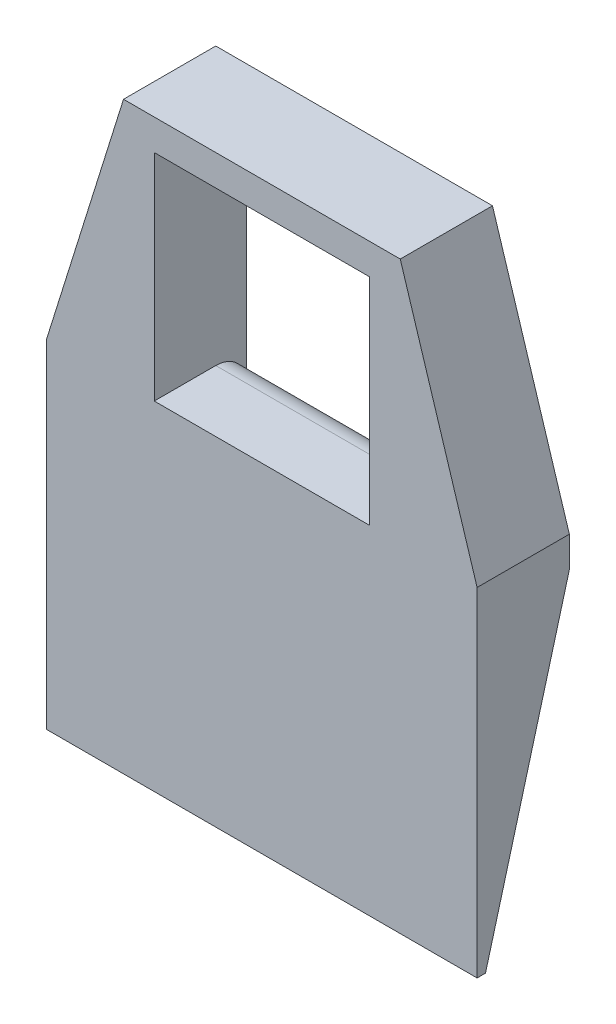
ISO-10303-21;
HEADER;
FILE_DESCRIPTION(('STEP AP214'),'2;1');
FILE_NAME('part.step','',(''),(''),'','','');
FILE_SCHEMA(('AUTOMOTIVE_DESIGN { 1 0 10303 214 1 1 1 1 }'));
ENDSEC;
DATA;
#1=APPLICATION_CONTEXT('core data for automotive mechanical design processes');
#2=APPLICATION_PROTOCOL_DEFINITION('international standard','automotive_design',2000,#1);
#3=PRODUCT_CONTEXT('',#1,'mechanical');
#4=PRODUCT('Part','Part','',(#3));
#5=PRODUCT_RELATED_PRODUCT_CATEGORY('part','',(#4));
#6=PRODUCT_DEFINITION_FORMATION('','',#4);
#7=PRODUCT_DEFINITION_CONTEXT('part definition',#1,'design');
#8=PRODUCT_DEFINITION('design','',#6,#7);
#9=PRODUCT_DEFINITION_SHAPE('','',#8);
#10=(LENGTH_UNIT() NAMED_UNIT(*) SI_UNIT(.MILLI.,.METRE.));
#11=(NAMED_UNIT(*) PLANE_ANGLE_UNIT() SI_UNIT($,.RADIAN.));
#12=(NAMED_UNIT(*) SI_UNIT($,.STERADIAN.) SOLID_ANGLE_UNIT());
#13=UNCERTAINTY_MEASURE_WITH_UNIT(LENGTH_MEASURE(1.E-05),#10,'distance_accuracy_value','');
#14=(GEOMETRIC_REPRESENTATION_CONTEXT(3) GLOBAL_UNCERTAINTY_ASSIGNED_CONTEXT((#13)) GLOBAL_UNIT_ASSIGNED_CONTEXT((#10,
#11,#12)) REPRESENTATION_CONTEXT('',''));
#15=CARTESIAN_POINT('',(0.,0.,0.));
#16=DIRECTION('',(0.,0.,1.));
#17=DIRECTION('',(1.,0.,0.));
#18=AXIS2_PLACEMENT_3D('',#15,#16,#17);
#19=CARTESIAN_POINT('',(-7.,18.,-3.));
#20=DIRECTION('',(-1.,0.,0.));
#21=DIRECTION('',(0.,0.,1.));
#22=AXIS2_PLACEMENT_3D('',#19,#20,#21);
#23=PLANE('',#22);
#24=DIRECTION('',(0.,0.,-1.));
#25=VECTOR('',#24,1.);
#26=CARTESIAN_POINT('',(-7.,16.,3.));
#27=LINE('',#26,#25);
#28=CARTESIAN_POINT('',(-7.,16.,3.));
#29=VERTEX_POINT('',#28);
#30=CARTESIAN_POINT('',(-7.,16.,-3.));
#31=VERTEX_POINT('',#30);
#32=EDGE_CURVE('E171',#29,#31,#27,.T.);
#33=ORIENTED_EDGE('',*,*,#32,.F.);
#34=DIRECTION('',(0.,-1.,0.));
#35=VECTOR('',#34,1.);
#36=CARTESIAN_POINT('',(-7.,18.,3.));
#37=LINE('',#36,#35);
#38=CARTESIAN_POINT('',(-7.,2.,3.));
#39=VERTEX_POINT('',#38);
#40=EDGE_CURVE('E205',#29,#39,#37,.T.);
#41=ORIENTED_EDGE('',*,*,#40,.T.);
#42=DIRECTION('',(0.,0.,-1.));
#43=VECTOR('',#42,1.);
#44=CARTESIAN_POINT('',(-7.,2.,-3.));
#45=LINE('',#44,#43);
#46=CARTESIAN_POINT('',(-7.,2.,-1.));
#47=VERTEX_POINT('',#46);
#48=EDGE_CURVE('E195',#39,#47,#45,.T.);
#49=ORIENTED_EDGE('',*,*,#48,.T.);
#50=CARTESIAN_POINT('',(-7.,0.,-1.));
#51=DIRECTION('',(-1.,0.,0.));
#52=DIRECTION('',(0.,0.,1.));
#53=AXIS2_PLACEMENT_3D('',#50,#51,#52);
#54=CIRCLE('',#53,2.);
#55=CARTESIAN_POINT('',(-7.,0.,-3.));
#56=VERTEX_POINT('',#55);
#57=EDGE_CURVE('E41',#47,#56,#54,.T.);
#58=ORIENTED_EDGE('',*,*,#57,.T.);
#59=DIRECTION('',(0.,-1.,0.));
#60=VECTOR('',#59,1.);
#61=CARTESIAN_POINT('',(-7.,18.,-3.));
#62=LINE('',#61,#60);
#63=EDGE_CURVE('E55',#31,#56,#62,.T.);
#64=ORIENTED_EDGE('',*,*,#63,.F.);
#65=EDGE_LOOP('',(#33,#41,#49,#58,#64));
#66=FACE_BOUND('',#65,.T.);
#67=ADVANCED_FACE('F33',(#66),#23,.F.);
#68=CARTESIAN_POINT('',(7.,18.,-3.));
#69=DIRECTION('',(1.,0.,0.));
#70=DIRECTION('',(0.,0.,-1.));
#71=AXIS2_PLACEMENT_3D('',#68,#69,#70);
#72=PLANE('',#71);
#73=DIRECTION('',(0.,0.,-1.));
#74=VECTOR('',#73,1.);
#75=CARTESIAN_POINT('',(7.,16.,3.));
#76=LINE('',#75,#74);
#77=CARTESIAN_POINT('',(7.,16.,3.));
#78=VERTEX_POINT('',#77);
#79=CARTESIAN_POINT('',(7.,16.,-3.));
#80=VERTEX_POINT('',#79);
#81=EDGE_CURVE('E182',#78,#80,#76,.T.);
#82=ORIENTED_EDGE('',*,*,#81,.T.);
#83=DIRECTION('',(0.,-1.,0.));
#84=VECTOR('',#83,1.);
#85=CARTESIAN_POINT('',(7.,18.,-3.));
#86=LINE('',#85,#84);
#87=CARTESIAN_POINT('',(7.,0.,-3.));
#88=VERTEX_POINT('',#87);
#89=EDGE_CURVE('E47',#80,#88,#86,.T.);
#90=ORIENTED_EDGE('',*,*,#89,.T.);
#91=CARTESIAN_POINT('',(7.,0.,-1.));
#92=DIRECTION('',(1.,0.,0.));
#93=DIRECTION('',(0.,0.,-1.));
#94=AXIS2_PLACEMENT_3D('',#91,#92,#93);
#95=CIRCLE('',#94,2.);
#96=CARTESIAN_POINT('',(7.,2.,-1.));
#97=VERTEX_POINT('',#96);
#98=EDGE_CURVE('E11',#88,#97,#95,.T.);
#99=ORIENTED_EDGE('',*,*,#98,.T.);
#100=DIRECTION('',(0.,0.,1.));
#101=VECTOR('',#100,1.);
#102=CARTESIAN_POINT('',(7.,2.,-3.));
#103=LINE('',#102,#101);
#104=CARTESIAN_POINT('',(7.,2.,3.));
#105=VERTEX_POINT('',#104);
#106=EDGE_CURVE('E189',#97,#105,#103,.T.);
#107=ORIENTED_EDGE('',*,*,#106,.T.);
#108=DIRECTION('',(0.,-1.,0.));
#109=VECTOR('',#108,1.);
#110=CARTESIAN_POINT('',(7.,18.,3.));
#111=LINE('',#110,#109);
#112=EDGE_CURVE('E191',#78,#105,#111,.T.);
#113=ORIENTED_EDGE('',*,*,#112,.F.);
#114=EDGE_LOOP('',(#82,#90,#99,#107,#113));
#115=FACE_BOUND('',#114,.T.);
#116=ADVANCED_FACE('F228',(#115),#72,.F.);
#117=CARTESIAN_POINT('',(0.,2.,0.));
#118=DIRECTION('',(0.,1.,0.));
#119=DIRECTION('',(0.,0.,1.));
#120=AXIS2_PLACEMENT_3D('',#117,#118,#119);
#121=PLANE('',#120);
#122=ORIENTED_EDGE('',*,*,#106,.F.);
#123=DIRECTION('',(-1.,0.,0.));
#124=VECTOR('',#123,1.);
#125=CARTESIAN_POINT('',(-7.,2.,-1.));
#126=LINE('',#125,#124);
#127=EDGE_CURVE('E133',#97,#47,#126,.T.);
#128=ORIENTED_EDGE('',*,*,#127,.T.);
#129=ORIENTED_EDGE('',*,*,#48,.F.);
#130=DIRECTION('',(1.,0.,0.));
#131=VECTOR('',#130,1.);
#132=CARTESIAN_POINT('',(-14.,2.,3.));
#133=LINE('',#132,#131);
#134=EDGE_CURVE('E207',#39,#105,#133,.T.);
#135=ORIENTED_EDGE('',*,*,#134,.T.);
#136=EDGE_LOOP('',(#122,#128,#129,#135));
#137=FACE_BOUND('',#136,.T.);
#138=ADVANCED_FACE('F231',(#137),#121,.T.);
#139=CARTESIAN_POINT('',(14.,2.,-3.));
#140=DIRECTION('',(-1.,0.,0.));
#141=DIRECTION('',(0.,0.,1.));
#142=AXIS2_PLACEMENT_3D('',#139,#140,#141);
#143=PLANE('',#142);
#144=DIRECTION('',(0.,-1.,0.));
#145=VECTOR('',#144,1.);
#146=CARTESIAN_POINT('',(14.,2.,3.));
#147=LINE('',#146,#145);
#148=CARTESIAN_POINT('',(14.,2.,3.));
#149=VERTEX_POINT('',#148);
#150=CARTESIAN_POINT('',(14.,-20.,3.));
#151=VERTEX_POINT('',#150);
#152=EDGE_CURVE('E145',#149,#151,#147,.T.);
#153=ORIENTED_EDGE('',*,*,#152,.T.);
#154=DIRECTION('',(0.,0.,1.));
#155=VECTOR('',#154,1.);
#156=CARTESIAN_POINT('',(14.,-20.,3.));
#157=LINE('',#156,#155);
#158=CARTESIAN_POINT('',(14.,-20.,2.45454545454545));
#159=VERTEX_POINT('',#158);
#160=EDGE_CURVE('E126',#159,#151,#157,.T.);
#161=ORIENTED_EDGE('',*,*,#160,.F.);
#162=DIRECTION('',(0.,-0.964763821237732,0.263117405792109));
#163=VECTOR('',#162,1.);
#164=CARTESIAN_POINT('',(14.,0.,-3.));
#165=LINE('',#164,#163);
#166=CARTESIAN_POINT('',(14.,0.,-3.));
#167=VERTEX_POINT('',#166);
#168=EDGE_CURVE('E141',#167,#159,#165,.T.);
#169=ORIENTED_EDGE('',*,*,#168,.F.);
#170=DIRECTION('',(0.,-1.,0.));
#171=VECTOR('',#170,1.);
#172=CARTESIAN_POINT('',(14.,2.,-3.));
#173=LINE('',#172,#171);
#174=CARTESIAN_POINT('',(14.,2.,-3.));
#175=VERTEX_POINT('',#174);
#176=EDGE_CURVE('E134',#175,#167,#173,.T.);
#177=ORIENTED_EDGE('',*,*,#176,.F.);
#178=DIRECTION('',(0.,0.,-1.));
#179=VECTOR('',#178,1.);
#180=CARTESIAN_POINT('',(14.,2.,3.));
#181=LINE('',#180,#179);
#182=EDGE_CURVE('E169',#149,#175,#181,.T.);
#183=ORIENTED_EDGE('',*,*,#182,.F.);
#184=EDGE_LOOP('',(#153,#161,#169,#177,#183));
#185=FACE_BOUND('',#184,.T.);
#186=ADVANCED_FACE('F139',(#185),#143,.F.);
#187=CARTESIAN_POINT('',(-14.,2.,-3.));
#188=DIRECTION('',(0.,0.,1.));
#189=DIRECTION('',(1.,0.,0.));
#190=AXIS2_PLACEMENT_3D('',#187,#188,#189);
#191=PLANE('',#190);
#192=ORIENTED_EDGE('',*,*,#63,.T.);
#193=DIRECTION('',(1.,0.,0.));
#194=VECTOR('',#193,1.);
#195=CARTESIAN_POINT('',(-16.,0.,-2.99999999999999));
#196=LINE('',#195,#194);
#197=CARTESIAN_POINT('',(-14.,0.,-2.99999999999999));
#198=VERTEX_POINT('',#197);
#199=EDGE_CURVE('E154',#198,#56,#196,.T.);
#200=ORIENTED_EDGE('',*,*,#199,.F.);
#201=DIRECTION('',(0.,-1.,0.));
#202=VECTOR('',#201,1.);
#203=CARTESIAN_POINT('',(-14.,2.,-3.));
#204=LINE('',#203,#202);
#205=CARTESIAN_POINT('',(-14.,2.,-3.));
#206=VERTEX_POINT('',#205);
#207=EDGE_CURVE('E214',#206,#198,#204,.T.);
#208=ORIENTED_EDGE('',*,*,#207,.F.);
#209=DIRECTION('',(-0.298274993135947,-0.95447997803503,0.));
#210=VECTOR('',#209,1.);
#211=CARTESIAN_POINT('',(-14.,2.,-3.));
#212=LINE('',#211,#210);
#213=CARTESIAN_POINT('',(-9.,18.,-3.));
#214=VERTEX_POINT('',#213);
#215=EDGE_CURVE('E161',#214,#206,#212,.T.);
#216=ORIENTED_EDGE('',*,*,#215,.F.);
#217=DIRECTION('',(-1.,0.,0.));
#218=VECTOR('',#217,1.);
#219=CARTESIAN_POINT('',(-14.,18.,-3.));
#220=LINE('',#219,#218);
#221=CARTESIAN_POINT('',(9.,18.,-3.));
#222=VERTEX_POINT('',#221);
#223=EDGE_CURVE('E199',#222,#214,#220,.T.);
#224=ORIENTED_EDGE('',*,*,#223,.F.);
#225=DIRECTION('',(-0.298274993135947,0.95447997803503,0.));
#226=VECTOR('',#225,1.);
#227=CARTESIAN_POINT('',(14.,2.,-3.));
#228=LINE('',#227,#226);
#229=EDGE_CURVE('E166',#175,#222,#228,.T.);
#230=ORIENTED_EDGE('',*,*,#229,.F.);
#231=ORIENTED_EDGE('',*,*,#176,.T.);
#232=EDGE_CURVE('E150',#88,#167,#196,.T.);
#233=ORIENTED_EDGE('',*,*,#232,.F.);
#234=ORIENTED_EDGE('',*,*,#89,.F.);
#235=DIRECTION('',(-1.,0.,0.));
#236=VECTOR('',#235,1.);
#237=CARTESIAN_POINT('',(7.,16.,-3.));
#238=LINE('',#237,#236);
#239=EDGE_CURVE('E184',#80,#31,#238,.T.);
#240=ORIENTED_EDGE('',*,*,#239,.T.);
#241=EDGE_LOOP('',(#192,#200,#208,#216,#224,#230,#231,#233,#234,#240));
#242=FACE_BOUND('',#241,.T.);
#243=ADVANCED_FACE('F239',(#242),#191,.F.);
#244=CARTESIAN_POINT('',(-14.,2.,-3.));
#245=DIRECTION('',(1.,0.,0.));
#246=DIRECTION('',(0.,0.,-1.));
#247=AXIS2_PLACEMENT_3D('',#244,#245,#246);
#248=PLANE('',#247);
#249=DIRECTION('',(0.,-0.964763821237732,0.263117405792109));
#250=VECTOR('',#249,1.);
#251=CARTESIAN_POINT('',(-14.,1.86153846153846,-3.5076923076923));
#252=LINE('',#251,#250);
#253=CARTESIAN_POINT('',(-14.,-20.,2.45454545454546));
#254=VERTEX_POINT('',#253);
#255=EDGE_CURVE('E159',#198,#254,#252,.T.);
#256=ORIENTED_EDGE('',*,*,#255,.T.);
#257=DIRECTION('',(0.,0.,1.));
#258=VECTOR('',#257,1.);
#259=CARTESIAN_POINT('',(-14.,-20.,-3.));
#260=LINE('',#259,#258);
#261=CARTESIAN_POINT('',(-14.,-20.,3.00000000000001));
#262=VERTEX_POINT('',#261);
#263=EDGE_CURVE('E129',#254,#262,#260,.T.);
#264=ORIENTED_EDGE('',*,*,#263,.T.);
#265=DIRECTION('',(0.,-1.,0.));
#266=VECTOR('',#265,1.);
#267=CARTESIAN_POINT('',(-14.,2.,3.));
#268=LINE('',#267,#266);
#269=CARTESIAN_POINT('',(-14.,2.,3.));
#270=VERTEX_POINT('',#269);
#271=EDGE_CURVE('E211',#270,#262,#268,.T.);
#272=ORIENTED_EDGE('',*,*,#271,.F.);
#273=DIRECTION('',(0.,0.,-1.));
#274=VECTOR('',#273,1.);
#275=CARTESIAN_POINT('',(-14.,2.,3.));
#276=LINE('',#275,#274);
#277=EDGE_CURVE('E177',#270,#206,#276,.T.);
#278=ORIENTED_EDGE('',*,*,#277,.T.);
#279=ORIENTED_EDGE('',*,*,#207,.T.);
#280=EDGE_LOOP('',(#256,#264,#272,#278,#279));
#281=FACE_BOUND('',#280,.T.);
#282=ADVANCED_FACE('F246',(#281),#248,.F.);
#283=CARTESIAN_POINT('',(-14.,2.,3.));
#284=DIRECTION('',(0.,0.,-1.));
#285=DIRECTION('',(-1.,0.,0.));
#286=AXIS2_PLACEMENT_3D('',#283,#284,#285);
#287=PLANE('',#286);
#288=ORIENTED_EDGE('',*,*,#40,.F.);
#289=DIRECTION('',(-1.,0.,0.));
#290=VECTOR('',#289,1.);
#291=CARTESIAN_POINT('',(7.,16.,3.));
#292=LINE('',#291,#290);
#293=EDGE_CURVE('E187',#78,#29,#292,.T.);
#294=ORIENTED_EDGE('',*,*,#293,.F.);
#295=ORIENTED_EDGE('',*,*,#112,.T.);
#296=ORIENTED_EDGE('',*,*,#134,.F.);
#297=EDGE_LOOP('',(#288,#294,#295,#296));
#298=FACE_BOUND('',#297,.T.);
#299=ORIENTED_EDGE('',*,*,#271,.T.);
#300=DIRECTION('',(1.,0.,0.));
#301=VECTOR('',#300,1.);
#302=CARTESIAN_POINT('',(-16.,-20.,3.00000000000001));
#303=LINE('',#302,#301);
#304=EDGE_CURVE('E146',#262,#151,#303,.T.);
#305=ORIENTED_EDGE('',*,*,#304,.T.);
#306=ORIENTED_EDGE('',*,*,#152,.F.);
#307=DIRECTION('',(-0.298274993135947,0.95447997803503,0.));
#308=VECTOR('',#307,1.);
#309=CARTESIAN_POINT('',(14.,2.,3.));
#310=LINE('',#309,#308);
#311=CARTESIAN_POINT('',(9.,18.,3.));
#312=VERTEX_POINT('',#311);
#313=EDGE_CURVE('E162',#149,#312,#310,.T.);
#314=ORIENTED_EDGE('',*,*,#313,.T.);
#315=DIRECTION('',(1.,0.,0.));
#316=VECTOR('',#315,1.);
#317=CARTESIAN_POINT('',(-14.,18.,3.));
#318=LINE('',#317,#316);
#319=CARTESIAN_POINT('',(-9.,18.,3.));
#320=VERTEX_POINT('',#319);
#321=EDGE_CURVE('E196',#320,#312,#318,.T.);
#322=ORIENTED_EDGE('',*,*,#321,.F.);
#323=DIRECTION('',(-0.298274993135947,-0.95447997803503,0.));
#324=VECTOR('',#323,1.);
#325=CARTESIAN_POINT('',(-14.,2.,3.));
#326=LINE('',#325,#324);
#327=EDGE_CURVE('E174',#320,#270,#326,.T.);
#328=ORIENTED_EDGE('',*,*,#327,.T.);
#329=EDGE_LOOP('',(#299,#305,#306,#314,#322,#328));
#330=FACE_BOUND('',#329,.T.);
#331=ADVANCED_FACE('F235',(#298,#330),#287,.F.);
#332=CARTESIAN_POINT('',(0.,18.,0.));
#333=DIRECTION('',(0.,1.,0.));
#334=DIRECTION('',(0.,0.,1.));
#335=AXIS2_PLACEMENT_3D('',#332,#333,#334);
#336=PLANE('',#335);
#337=DIRECTION('',(0.,0.,-1.));
#338=VECTOR('',#337,1.);
#339=CARTESIAN_POINT('',(9.,18.,3.));
#340=LINE('',#339,#338);
#341=EDGE_CURVE('E165',#312,#222,#340,.T.);
#342=ORIENTED_EDGE('',*,*,#341,.T.);
#343=ORIENTED_EDGE('',*,*,#223,.T.);
#344=DIRECTION('',(0.,0.,-1.));
#345=VECTOR('',#344,1.);
#346=CARTESIAN_POINT('',(-9.,18.,3.));
#347=LINE('',#346,#345);
#348=EDGE_CURVE('E168',#320,#214,#347,.T.);
#349=ORIENTED_EDGE('',*,*,#348,.F.);
#350=ORIENTED_EDGE('',*,*,#321,.T.);
#351=EDGE_LOOP('',(#342,#343,#349,#350));
#352=FACE_BOUND('',#351,.T.);
#353=ADVANCED_FACE('F251',(#352),#336,.T.);
#354=CARTESIAN_POINT('',(7.,16.,3.));
#355=DIRECTION('',(0.,1.,0.));
#356=DIRECTION('',(0.,0.,1.));
#357=AXIS2_PLACEMENT_3D('',#354,#355,#356);
#358=PLANE('',#357);
#359=ORIENTED_EDGE('',*,*,#32,.T.);
#360=ORIENTED_EDGE('',*,*,#239,.F.);
#361=ORIENTED_EDGE('',*,*,#81,.F.);
#362=ORIENTED_EDGE('',*,*,#293,.T.);
#363=EDGE_LOOP('',(#359,#360,#361,#362));
#364=FACE_BOUND('',#363,.T.);
#365=ADVANCED_FACE('F261',(#364),#358,.F.);
#366=CARTESIAN_POINT('',(-14.,2.,3.));
#367=DIRECTION('',(0.95447997803503,-0.298274993135947,0.));
#368=DIRECTION('',(0.298274993135947,0.95447997803503,0.));
#369=AXIS2_PLACEMENT_3D('',#366,#367,#368);
#370=PLANE('',#369);
#371=ORIENTED_EDGE('',*,*,#215,.T.);
#372=ORIENTED_EDGE('',*,*,#277,.F.);
#373=ORIENTED_EDGE('',*,*,#327,.F.);
#374=ORIENTED_EDGE('',*,*,#348,.T.);
#375=EDGE_LOOP('',(#371,#372,#373,#374));
#376=FACE_BOUND('',#375,.T.);
#377=ADVANCED_FACE('F254',(#376),#370,.F.);
#378=CARTESIAN_POINT('',(14.,2.,3.));
#379=DIRECTION('',(-0.95447997803503,-0.298274993135947,0.));
#380=DIRECTION('',(0.298274993135947,-0.95447997803503,0.));
#381=AXIS2_PLACEMENT_3D('',#378,#379,#380);
#382=PLANE('',#381);
#383=ORIENTED_EDGE('',*,*,#229,.T.);
#384=ORIENTED_EDGE('',*,*,#341,.F.);
#385=ORIENTED_EDGE('',*,*,#313,.F.);
#386=ORIENTED_EDGE('',*,*,#182,.T.);
#387=EDGE_LOOP('',(#383,#384,#385,#386));
#388=FACE_BOUND('',#387,.T.);
#389=ADVANCED_FACE('F252',(#388),#382,.F.);
#390=CARTESIAN_POINT('',(-16.,0.,-2.99999999999999));
#391=DIRECTION('',(0.,0.263117405792109,0.964763821237732));
#392=DIRECTION('',(0.,-0.964763821237732,0.263117405792109));
#393=AXIS2_PLACEMENT_3D('',#390,#391,#392);
#394=PLANE('',#393);
#395=ORIENTED_EDGE('',*,*,#168,.T.);
#396=DIRECTION('',(-1.,0.,0.));
#397=VECTOR('',#396,1.);
#398=CARTESIAN_POINT('',(-16.,-20.,2.45454545454546));
#399=LINE('',#398,#397);
#400=EDGE_CURVE('E123',#159,#254,#399,.T.);
#401=ORIENTED_EDGE('',*,*,#400,.T.);
#402=ORIENTED_EDGE('',*,*,#255,.F.);
#403=ORIENTED_EDGE('',*,*,#199,.T.);
#404=EDGE_CURVE('E152',#56,#88,#196,.T.);
#405=ORIENTED_EDGE('',*,*,#404,.T.);
#406=ORIENTED_EDGE('',*,*,#232,.T.);
#407=EDGE_LOOP('',(#395,#401,#402,#403,#405,#406));
#408=FACE_BOUND('',#407,.T.);
#409=ADVANCED_FACE('F148',(#408),#394,.F.);
#410=CARTESIAN_POINT('',(-16.,-20.,3.00000000000001));
#411=DIRECTION('',(0.,1.,0.));
#412=DIRECTION('',(0.,0.,1.));
#413=AXIS2_PLACEMENT_3D('',#410,#411,#412);
#414=PLANE('',#413);
#415=ORIENTED_EDGE('',*,*,#400,.F.);
#416=ORIENTED_EDGE('',*,*,#160,.T.);
#417=ORIENTED_EDGE('',*,*,#304,.F.);
#418=ORIENTED_EDGE('',*,*,#263,.F.);
#419=EDGE_LOOP('',(#415,#416,#417,#418));
#420=FACE_BOUND('',#419,.T.);
#421=ADVANCED_FACE('F125',(#420),#414,.F.);
#422=CARTESIAN_POINT('',(0.,0.,-1.));
#423=DIRECTION('',(1.,0.,0.));
#424=DIRECTION('',(0.,0.,-1.));
#425=AXIS2_PLACEMENT_3D('',#422,#423,#424);
#426=CYLINDRICAL_SURFACE('',#425,2.);
#427=ORIENTED_EDGE('',*,*,#98,.F.);
#428=ORIENTED_EDGE('',*,*,#404,.F.);
#429=ORIENTED_EDGE('',*,*,#57,.F.);
#430=ORIENTED_EDGE('',*,*,#127,.F.);
#431=EDGE_LOOP('',(#427,#428,#429,#430));
#432=FACE_BOUND('',#431,.T.);
#433=ADVANCED_FACE('F35',(#432),#426,.T.);
#434=CLOSED_SHELL('',(#67,#116,#138,#186,#243,#282,#331,#353,#365,#377,#389,#409,#421,#433));
#435=MANIFOLD_SOLID_BREP('B2',#434);
#436=ADVANCED_BREP_SHAPE_REPRESENTATION('',(#18,#435),#14);
#437=SHAPE_DEFINITION_REPRESENTATION(#9,#436);
ENDSEC;
END-ISO-10303-21;
